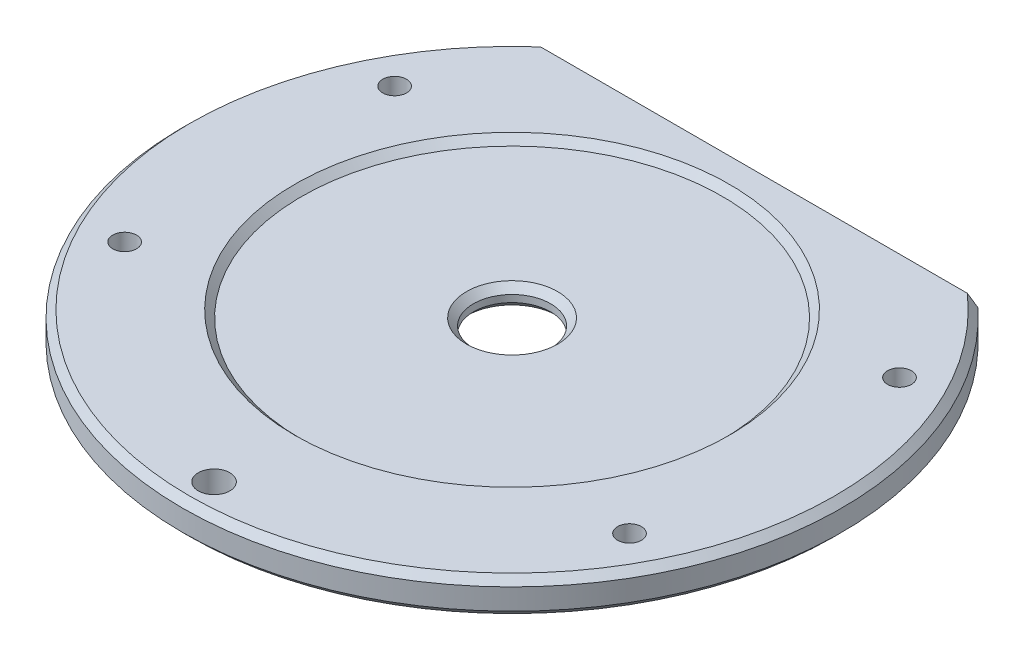
ISO-10303-21;
HEADER;
FILE_DESCRIPTION(('STEP AP214'),'2;1');
FILE_NAME('part.step','',(''),(''),'','','');
FILE_SCHEMA(('AUTOMOTIVE_DESIGN { 1 0 10303 214 1 1 1 1 }'));
ENDSEC;
DATA;
#1=APPLICATION_CONTEXT('core data for automotive mechanical design processes');
#2=APPLICATION_PROTOCOL_DEFINITION('international standard','automotive_design',2000,#1);
#3=PRODUCT_CONTEXT('',#1,'mechanical');
#4=PRODUCT('Part','Part','',(#3));
#5=PRODUCT_RELATED_PRODUCT_CATEGORY('part','',(#4));
#6=PRODUCT_DEFINITION_FORMATION('','',#4);
#7=PRODUCT_DEFINITION_CONTEXT('part definition',#1,'design');
#8=PRODUCT_DEFINITION('design','',#6,#7);
#9=PRODUCT_DEFINITION_SHAPE('','',#8);
#10=(LENGTH_UNIT() NAMED_UNIT(*) SI_UNIT(.MILLI.,.METRE.));
#11=(NAMED_UNIT(*) PLANE_ANGLE_UNIT() SI_UNIT($,.RADIAN.));
#12=(NAMED_UNIT(*) SI_UNIT($,.STERADIAN.) SOLID_ANGLE_UNIT());
#13=UNCERTAINTY_MEASURE_WITH_UNIT(LENGTH_MEASURE(1.E-05),#10,'distance_accuracy_value','');
#14=(GEOMETRIC_REPRESENTATION_CONTEXT(3) GLOBAL_UNCERTAINTY_ASSIGNED_CONTEXT((#13)) GLOBAL_UNIT_ASSIGNED_CONTEXT((#10,
#11,#12)) REPRESENTATION_CONTEXT('',''));
#15=CARTESIAN_POINT('',(0.,0.,0.));
#16=DIRECTION('',(0.,0.,1.));
#17=DIRECTION('',(1.,0.,0.));
#18=AXIS2_PLACEMENT_3D('',#15,#16,#17);
#19=CARTESIAN_POINT('',(0.,-5.,0.));
#20=DIRECTION('',(0.,1.,0.));
#21=DIRECTION('',(0.,0.,1.));
#22=AXIS2_PLACEMENT_3D('',#19,#20,#21);
#23=CYLINDRICAL_SURFACE('',#22,11.);
#24=CARTESIAN_POINT('',(0.,0.999999999999969,0.));
#25=DIRECTION('',(0.,1.,0.));
#26=DIRECTION('',(0.,0.,1.));
#27=AXIS2_PLACEMENT_3D('',#24,#25,#26);
#28=CIRCLE('',#27,11.);
#29=CARTESIAN_POINT('',(0.,0.999999999999969,11.));
#30=VERTEX_POINT('',#29);
#31=EDGE_CURVE('E138',#30,#30,#28,.T.);
#32=ORIENTED_EDGE('',*,*,#31,.T.);
#33=EDGE_LOOP('',(#32));
#34=FACE_BOUND('',#33,.T.);
#35=CARTESIAN_POINT('',(0.,-0.999999999999969,0.));
#36=DIRECTION('',(0.,-1.,0.));
#37=DIRECTION('',(0.,0.,-1.));
#38=AXIS2_PLACEMENT_3D('',#35,#36,#37);
#39=CIRCLE('',#38,11.);
#40=CARTESIAN_POINT('',(0.,-0.999999999999969,-11.));
#41=VERTEX_POINT('',#40);
#42=EDGE_CURVE('E141',#41,#41,#39,.T.);
#43=ORIENTED_EDGE('',*,*,#42,.T.);
#44=EDGE_LOOP('',(#43));
#45=FACE_BOUND('',#44,.T.);
#46=ADVANCED_FACE('F34',(#34,#45),#23,.F.);
#47=CARTESIAN_POINT('',(0.,-5.,0.));
#48=DIRECTION('',(0.,1.,0.));
#49=DIRECTION('',(0.,0.,1.));
#50=AXIS2_PLACEMENT_3D('',#47,#48,#49);
#51=PLANE('',#50);
#52=CARTESIAN_POINT('',(0.,-5.,0.));
#53=DIRECTION('',(0.,1.,0.));
#54=DIRECTION('',(0.,0.,1.));
#55=AXIS2_PLACEMENT_3D('',#52,#53,#54);
#56=CIRCLE('',#55,62.);
#57=CARTESIAN_POINT('',(0.,-5.,62.));
#58=VERTEX_POINT('',#57);
#59=EDGE_CURVE('E85',#58,#58,#56,.T.);
#60=ORIENTED_EDGE('',*,*,#59,.T.);
#61=EDGE_LOOP('',(#60));
#62=FACE_BOUND('',#61,.T.);
#63=CARTESIAN_POINT('',(0.,-5.,85.));
#64=DIRECTION('',(0.,1.,0.));
#65=DIRECTION('',(0.,0.,1.));
#66=AXIS2_PLACEMENT_3D('',#63,#64,#65);
#67=CIRCLE('',#66,4.5);
#68=CARTESIAN_POINT('',(0.,-5.,89.5));
#69=VERTEX_POINT('',#68);
#70=EDGE_CURVE('E181',#69,#69,#67,.T.);
#71=ORIENTED_EDGE('',*,*,#70,.T.);
#72=EDGE_LOOP('',(#71));
#73=FACE_BOUND('',#72,.T.);
#74=CARTESIAN_POINT('',(-72.,-5.,-38.5));
#75=DIRECTION('',(0.,1.,0.));
#76=DIRECTION('',(0.,0.,1.));
#77=AXIS2_PLACEMENT_3D('',#74,#75,#76);
#78=CIRCLE('',#77,3.4);
#79=CARTESIAN_POINT('',(-72.,-5.,-35.1));
#80=VERTEX_POINT('',#79);
#81=EDGE_CURVE('E175',#80,#80,#78,.T.);
#82=ORIENTED_EDGE('',*,*,#81,.T.);
#83=EDGE_LOOP('',(#82));
#84=FACE_BOUND('',#83,.T.);
#85=CARTESIAN_POINT('',(72.,-5.,-38.5));
#86=DIRECTION('',(0.,1.,0.));
#87=DIRECTION('',(0.,0.,1.));
#88=AXIS2_PLACEMENT_3D('',#85,#86,#87);
#89=CIRCLE('',#88,3.4);
#90=CARTESIAN_POINT('',(72.,-5.,-35.1));
#91=VERTEX_POINT('',#90);
#92=EDGE_CURVE('E169',#91,#91,#89,.T.);
#93=ORIENTED_EDGE('',*,*,#92,.T.);
#94=EDGE_LOOP('',(#93));
#95=FACE_BOUND('',#94,.T.);
#96=CARTESIAN_POINT('',(-72.,-5.,38.5));
#97=DIRECTION('',(0.,1.,0.));
#98=DIRECTION('',(0.,0.,1.));
#99=AXIS2_PLACEMENT_3D('',#96,#97,#98);
#100=CIRCLE('',#99,3.4);
#101=CARTESIAN_POINT('',(-72.,-5.,41.9));
#102=VERTEX_POINT('',#101);
#103=EDGE_CURVE('E163',#102,#102,#100,.T.);
#104=ORIENTED_EDGE('',*,*,#103,.T.);
#105=EDGE_LOOP('',(#104));
#106=FACE_BOUND('',#105,.T.);
#107=CARTESIAN_POINT('',(72.,-5.,38.5));
#108=DIRECTION('',(0.,1.,0.));
#109=DIRECTION('',(0.,0.,1.));
#110=AXIS2_PLACEMENT_3D('',#107,#108,#109);
#111=CIRCLE('',#110,3.4);
#112=CARTESIAN_POINT('',(72.,-5.,41.9));
#113=VERTEX_POINT('',#112);
#114=EDGE_CURVE('E157',#113,#113,#111,.T.);
#115=ORIENTED_EDGE('',*,*,#114,.T.);
#116=EDGE_LOOP('',(#115));
#117=FACE_BOUND('',#116,.T.);
#118=DIRECTION('',(1.,0.,0.));
#119=VECTOR('',#118,1.);
#120=CARTESIAN_POINT('',(0.,-5.,-69.));
#121=LINE('',#120,#119);
#122=CARTESIAN_POINT('',(-60.8522801544856,-5.,-69.));
#123=VERTEX_POINT('',#122);
#124=CARTESIAN_POINT('',(60.8522801544856,-5.,-69.));
#125=VERTEX_POINT('',#124);
#126=EDGE_CURVE('E83',#123,#125,#121,.T.);
#127=ORIENTED_EDGE('',*,*,#126,.T.);
#128=CARTESIAN_POINT('',(0.,-5.,0.));
#129=DIRECTION('',(0.,1.,0.));
#130=DIRECTION('',(0.,0.,1.));
#131=AXIS2_PLACEMENT_3D('',#128,#129,#130);
#132=CIRCLE('',#131,92.);
#133=EDGE_CURVE('E80',#125,#123,#132,.F.);
#134=ORIENTED_EDGE('',*,*,#133,.T.);
#135=EDGE_LOOP('',(#127,#134));
#136=FACE_BOUND('',#135,.T.);
#137=ADVANCED_FACE('F82',(#62,#73,#84,#95,#106,#117,#136),#51,.F.);
#138=CARTESIAN_POINT('',(0.,5.,0.));
#139=DIRECTION('',(0.,-1.,0.));
#140=DIRECTION('',(0.,0.,-1.));
#141=AXIS2_PLACEMENT_3D('',#138,#139,#140);
#142=CYLINDRICAL_SURFACE('',#141,94.);
#143=DIRECTION('',(0.,-1.,0.));
#144=VECTOR('',#143,1.);
#145=CARTESIAN_POINT('',(-63.8357266740185,5.,-69.));
#146=LINE('',#145,#144);
#147=CARTESIAN_POINT('',(-63.8357266740185,2.99999999999994,-69.));
#148=VERTEX_POINT('',#147);
#149=CARTESIAN_POINT('',(-63.8357266740185,-3.00000000000001,-69.));
#150=VERTEX_POINT('',#149);
#151=EDGE_CURVE('E92',#148,#150,#146,.T.);
#152=ORIENTED_EDGE('',*,*,#151,.T.);
#153=CARTESIAN_POINT('',(0.,-3.00000000000001,0.));
#154=DIRECTION('',(0.,1.,0.));
#155=DIRECTION('',(0.,0.,1.));
#156=AXIS2_PLACEMENT_3D('',#153,#154,#155);
#157=CIRCLE('',#156,94.);
#158=CARTESIAN_POINT('',(63.8357266740185,-3.00000000000001,-69.));
#159=VERTEX_POINT('',#158);
#160=EDGE_CURVE('E95',#150,#159,#157,.T.);
#161=ORIENTED_EDGE('',*,*,#160,.T.);
#162=DIRECTION('',(0.,-1.,0.));
#163=VECTOR('',#162,1.);
#164=CARTESIAN_POINT('',(63.8357266740185,5.,-69.));
#165=LINE('',#164,#163);
#166=CARTESIAN_POINT('',(63.8357266740185,2.99999999999994,-69.));
#167=VERTEX_POINT('',#166);
#168=EDGE_CURVE('E147',#159,#167,#165,.F.);
#169=ORIENTED_EDGE('',*,*,#168,.T.);
#170=CARTESIAN_POINT('',(0.,2.99999999999994,0.));
#171=DIRECTION('',(0.,1.,0.));
#172=DIRECTION('',(0.,0.,1.));
#173=AXIS2_PLACEMENT_3D('',#170,#171,#172);
#174=CIRCLE('',#173,94.);
#175=EDGE_CURVE('E126',#167,#148,#174,.F.);
#176=ORIENTED_EDGE('',*,*,#175,.T.);
#177=EDGE_LOOP('',(#152,#161,#169,#176));
#178=FACE_BOUND('',#177,.T.);
#179=ADVANCED_FACE('F200',(#178),#142,.T.);
#180=CARTESIAN_POINT('',(0.,5.,0.));
#181=DIRECTION('',(0.,1.,0.));
#182=DIRECTION('',(0.,0.,1.));
#183=AXIS2_PLACEMENT_3D('',#180,#181,#182);
#184=PLANE('',#183);
#185=CARTESIAN_POINT('',(0.,5.,0.));
#186=DIRECTION('',(0.,1.,0.));
#187=DIRECTION('',(0.,0.,1.));
#188=AXIS2_PLACEMENT_3D('',#185,#186,#187);
#189=CIRCLE('',#188,62.);
#190=CARTESIAN_POINT('',(0.,5.,62.));
#191=VERTEX_POINT('',#190);
#192=EDGE_CURVE('E128',#191,#191,#189,.F.);
#193=ORIENTED_EDGE('',*,*,#192,.T.);
#194=EDGE_LOOP('',(#193));
#195=FACE_BOUND('',#194,.T.);
#196=CARTESIAN_POINT('',(0.,5.,85.));
#197=DIRECTION('',(0.,1.,0.));
#198=DIRECTION('',(0.,0.,1.));
#199=AXIS2_PLACEMENT_3D('',#196,#197,#198);
#200=CIRCLE('',#199,4.5);
#201=CARTESIAN_POINT('',(0.,5.,89.5));
#202=VERTEX_POINT('',#201);
#203=EDGE_CURVE('E182',#202,#202,#200,.T.);
#204=ORIENTED_EDGE('',*,*,#203,.F.);
#205=EDGE_LOOP('',(#204));
#206=FACE_BOUND('',#205,.T.);
#207=CARTESIAN_POINT('',(-72.,5.,-38.5));
#208=DIRECTION('',(0.,1.,0.));
#209=DIRECTION('',(0.,0.,1.));
#210=AXIS2_PLACEMENT_3D('',#207,#208,#209);
#211=CIRCLE('',#210,3.4);
#212=CARTESIAN_POINT('',(-72.,5.,-35.1));
#213=VERTEX_POINT('',#212);
#214=EDGE_CURVE('E178',#213,#213,#211,.T.);
#215=ORIENTED_EDGE('',*,*,#214,.F.);
#216=EDGE_LOOP('',(#215));
#217=FACE_BOUND('',#216,.T.);
#218=CARTESIAN_POINT('',(72.,5.,-38.5));
#219=DIRECTION('',(0.,1.,0.));
#220=DIRECTION('',(0.,0.,1.));
#221=AXIS2_PLACEMENT_3D('',#218,#219,#220);
#222=CIRCLE('',#221,3.4);
#223=CARTESIAN_POINT('',(72.,5.,-35.1));
#224=VERTEX_POINT('',#223);
#225=EDGE_CURVE('E172',#224,#224,#222,.T.);
#226=ORIENTED_EDGE('',*,*,#225,.F.);
#227=EDGE_LOOP('',(#226));
#228=FACE_BOUND('',#227,.T.);
#229=CARTESIAN_POINT('',(-72.,5.,38.5));
#230=DIRECTION('',(0.,1.,0.));
#231=DIRECTION('',(0.,0.,1.));
#232=AXIS2_PLACEMENT_3D('',#229,#230,#231);
#233=CIRCLE('',#232,3.4);
#234=CARTESIAN_POINT('',(-72.,5.,41.9));
#235=VERTEX_POINT('',#234);
#236=EDGE_CURVE('E166',#235,#235,#233,.T.);
#237=ORIENTED_EDGE('',*,*,#236,.F.);
#238=EDGE_LOOP('',(#237));
#239=FACE_BOUND('',#238,.T.);
#240=CARTESIAN_POINT('',(72.,5.,38.5));
#241=DIRECTION('',(0.,1.,0.));
#242=DIRECTION('',(0.,0.,1.));
#243=AXIS2_PLACEMENT_3D('',#240,#241,#242);
#244=CIRCLE('',#243,3.4);
#245=CARTESIAN_POINT('',(72.,5.,41.9));
#246=VERTEX_POINT('',#245);
#247=EDGE_CURVE('E160',#246,#246,#244,.T.);
#248=ORIENTED_EDGE('',*,*,#247,.F.);
#249=EDGE_LOOP('',(#248));
#250=FACE_BOUND('',#249,.T.);
#251=DIRECTION('',(1.,0.,0.));
#252=VECTOR('',#251,1.);
#253=CARTESIAN_POINT('',(-96.2922374429224,5.,-69.));
#254=LINE('',#253,#252);
#255=CARTESIAN_POINT('',(-60.8522801544856,5.,-69.));
#256=VERTEX_POINT('',#255);
#257=CARTESIAN_POINT('',(60.8522801544856,5.,-69.));
#258=VERTEX_POINT('',#257);
#259=EDGE_CURVE('E149',#256,#258,#254,.T.);
#260=ORIENTED_EDGE('',*,*,#259,.F.);
#261=CARTESIAN_POINT('',(0.,5.,0.));
#262=DIRECTION('',(0.,1.,0.));
#263=DIRECTION('',(0.,0.,1.));
#264=AXIS2_PLACEMENT_3D('',#261,#262,#263);
#265=CIRCLE('',#264,92.);
#266=EDGE_CURVE('E131',#256,#258,#265,.T.);
#267=ORIENTED_EDGE('',*,*,#266,.T.);
#268=EDGE_LOOP('',(#260,#267));
#269=FACE_BOUND('',#268,.T.);
#270=ADVANCED_FACE('F114',(#195,#206,#217,#228,#239,#250,#269),#184,.T.);
#271=CARTESIAN_POINT('',(-96.2922374429224,-5.,-69.));
#272=DIRECTION('',(0.,0.,1.));
#273=DIRECTION('',(1.,0.,0.));
#274=AXIS2_PLACEMENT_3D('',#271,#272,#273);
#275=PLANE('',#274);
#276=ORIENTED_EDGE('',*,*,#168,.F.);
#277=CARTESIAN_POINT('',(63.8357266740185,-3.00000000000001,-69.));
#278=CARTESIAN_POINT('',(63.588108661684,-3.16815814706882,-69.));
#279=CARTESIAN_POINT('',(63.3402456768234,-3.33595567307789,-69.));
#280=CARTESIAN_POINT('',(62.8440231824841,-3.67080993712542,-69.));
#281=CARTESIAN_POINT('',(62.5956636776362,-3.8378666820264,-69.));
#282=CARTESIAN_POINT('',(62.0984368913299,-4.17122301130456,-69.));
#283=CARTESIAN_POINT('',(61.8495696097177,-4.33752259545236,-69.));
#284=CARTESIAN_POINT('',(61.3513159270398,-4.66934726982986,-69.));
#285=CARTESIAN_POINT('',(61.1019295211762,-4.83487235285525,-69.));
#286=CARTESIAN_POINT('',(60.8522801544856,-5.,-69.));
#287=B_SPLINE_CURVE_WITH_KNOTS('',3,(#277,#278,#279,#280,#281,#282,#283,#284,#285,#286),
.UNSPECIFIED.,.F.,.F.,(4,2,2,2,4),(0.,0.897956663475132,1.79590499091896,2.69385359038765,
3.59181052593058),.UNSPECIFIED.);
#288=EDGE_CURVE('E11',#159,#125,#287,.T.);
#289=ORIENTED_EDGE('',*,*,#288,.T.);
#290=ORIENTED_EDGE('',*,*,#126,.F.);
#291=CARTESIAN_POINT('',(-60.8522801544856,-5.,-69.));
#292=CARTESIAN_POINT('',(-61.1019295211762,-4.83487235285524,-69.));
#293=CARTESIAN_POINT('',(-61.3513159270397,-4.66934726982984,-69.));
#294=CARTESIAN_POINT('',(-61.8495696097177,-4.33752259545235,-69.));
#295=CARTESIAN_POINT('',(-62.0984368913299,-4.17122301130456,-69.));
#296=CARTESIAN_POINT('',(-62.5956636776362,-3.83786668202639,-69.));
#297=CARTESIAN_POINT('',(-62.8440231824841,-3.6708099371254,-69.));
#298=CARTESIAN_POINT('',(-63.3402456768234,-3.33595567307786,-69.));
#299=CARTESIAN_POINT('',(-63.588108661684,-3.1681581470688,-69.));
#300=CARTESIAN_POINT('',(-63.8357266740186,-3.00000000000001,-69.));
#301=B_SPLINE_CURVE_WITH_KNOTS('',3,(#291,#292,#293,#294,#295,#296,#297,#298,#299,#300),
.UNSPECIFIED.,.F.,.F.,(4,2,2,2,4),(0.,0.897956935542931,1.79590553501163,2.69385386245547,
3.59181052593059),.UNSPECIFIED.);
#302=EDGE_CURVE('E48',#123,#150,#301,.T.);
#303=ORIENTED_EDGE('',*,*,#302,.T.);
#304=ORIENTED_EDGE('',*,*,#151,.F.);
#305=CARTESIAN_POINT('',(-63.8357266740185,2.99999999999994,-69.));
#306=CARTESIAN_POINT('',(-63.588108661684,3.16815814706874,-69.));
#307=CARTESIAN_POINT('',(-63.3402456768234,3.33595567307782,-69.));
#308=CARTESIAN_POINT('',(-62.8440231824841,3.67080993712536,-69.));
#309=CARTESIAN_POINT('',(-62.5956636776362,3.83786668202636,-69.));
#310=CARTESIAN_POINT('',(-62.0984368913298,4.17122301130454,-69.));
#311=CARTESIAN_POINT('',(-61.8495696097176,4.33752259545233,-69.));
#312=CARTESIAN_POINT('',(-61.3513159270397,4.66934726982984,-69.));
#313=CARTESIAN_POINT('',(-61.1019295211762,4.83487235285524,-69.));
#314=CARTESIAN_POINT('',(-60.8522801544856,5.00000000000002,-69.));
#315=B_SPLINE_CURVE_WITH_KNOTS('',3,(#305,#306,#307,#308,#309,#310,#311,#312,#313,#314),
.UNSPECIFIED.,.F.,.F.,(4,2,2,2,4),(0.,0.897956663475147,1.795904990919,2.69385359038772,
3.59181052593067),.UNSPECIFIED.);
#316=EDGE_CURVE('E96',#148,#256,#315,.T.);
#317=ORIENTED_EDGE('',*,*,#316,.T.);
#318=ORIENTED_EDGE('',*,*,#259,.T.);
#319=CARTESIAN_POINT('',(60.8522801544856,5.,-69.));
#320=CARTESIAN_POINT('',(61.1019295211762,4.83487235285524,-69.));
#321=CARTESIAN_POINT('',(61.3513159270397,4.66934726982984,-69.));
#322=CARTESIAN_POINT('',(61.8495696097176,4.33752259545233,-69.));
#323=CARTESIAN_POINT('',(62.0984368913298,4.17122301130454,-69.));
#324=CARTESIAN_POINT('',(62.5956636776362,3.83786668202636,-69.));
#325=CARTESIAN_POINT('',(62.8440231824841,3.67080993712538,-69.));
#326=CARTESIAN_POINT('',(63.3402456768234,3.33595567307784,-69.));
#327=CARTESIAN_POINT('',(63.588108661684,3.16815814706876,-69.));
#328=CARTESIAN_POINT('',(63.8357266740185,2.99999999999995,-69.));
#329=B_SPLINE_CURVE_WITH_KNOTS('',3,(#319,#320,#321,#322,#323,#324,#325,#326,#327,#328),
.UNSPECIFIED.,.F.,.F.,(4,2,2,2,4),(0.,0.897956935542949,1.79590553501166,2.6938538624555,
3.59181052593066),.UNSPECIFIED.);
#330=EDGE_CURVE('E55',#258,#167,#329,.T.);
#331=ORIENTED_EDGE('',*,*,#330,.T.);
#332=EDGE_LOOP('',(#276,#289,#290,#303,#304,#317,#318,#331));
#333=FACE_BOUND('',#332,.T.);
#334=ADVANCED_FACE('F88',(#333),#275,.F.);
#335=CARTESIAN_POINT('',(0.,3.,0.));
#336=DIRECTION('',(0.,1.,0.));
#337=DIRECTION('',(0.,0.,1.));
#338=AXIS2_PLACEMENT_3D('',#335,#336,#337);
#339=PLANE('',#338);
#340=CARTESIAN_POINT('',(0.,3.,0.));
#341=DIRECTION('',(0.,1.,0.));
#342=DIRECTION('',(0.,0.,1.));
#343=AXIS2_PLACEMENT_3D('',#340,#341,#342);
#344=CIRCLE('',#343,13.);
#345=CARTESIAN_POINT('',(0.,3.,13.));
#346=VERTEX_POINT('',#345);
#347=EDGE_CURVE('E91',#346,#346,#344,.F.);
#348=ORIENTED_EDGE('',*,*,#347,.T.);
#349=EDGE_LOOP('',(#348));
#350=FACE_BOUND('',#349,.T.);
#351=CARTESIAN_POINT('',(0.,3.,0.));
#352=DIRECTION('',(0.,1.,0.));
#353=DIRECTION('',(0.,0.,1.));
#354=AXIS2_PLACEMENT_3D('',#351,#352,#353);
#355=CIRCLE('',#354,60.);
#356=CARTESIAN_POINT('',(0.,3.,60.));
#357=VERTEX_POINT('',#356);
#358=EDGE_CURVE('E151',#357,#357,#355,.T.);
#359=ORIENTED_EDGE('',*,*,#358,.T.);
#360=EDGE_LOOP('',(#359));
#361=FACE_BOUND('',#360,.T.);
#362=ADVANCED_FACE('F113',(#350,#361),#339,.T.);
#363=CARTESIAN_POINT('',(0.,-3.,0.));
#364=DIRECTION('',(0.,-1.,0.));
#365=DIRECTION('',(0.,0.,1.));
#366=AXIS2_PLACEMENT_3D('',#363,#364,#365);
#367=PLANE('',#366);
#368=CARTESIAN_POINT('',(0.,-3.,0.));
#369=DIRECTION('',(0.,-1.,0.));
#370=DIRECTION('',(0.,0.,-1.));
#371=AXIS2_PLACEMENT_3D('',#368,#369,#370);
#372=CIRCLE('',#371,13.);
#373=CARTESIAN_POINT('',(0.,-3.,-13.));
#374=VERTEX_POINT('',#373);
#375=EDGE_CURVE('E86',#374,#374,#372,.F.);
#376=ORIENTED_EDGE('',*,*,#375,.T.);
#377=EDGE_LOOP('',(#376));
#378=FACE_BOUND('',#377,.T.);
#379=CARTESIAN_POINT('',(0.,-3.,0.));
#380=DIRECTION('',(0.,1.,0.));
#381=DIRECTION('',(0.,0.,1.));
#382=AXIS2_PLACEMENT_3D('',#379,#380,#381);
#383=CIRCLE('',#382,60.);
#384=CARTESIAN_POINT('',(0.,-3.,60.));
#385=VERTEX_POINT('',#384);
#386=EDGE_CURVE('E154',#385,#385,#383,.T.);
#387=ORIENTED_EDGE('',*,*,#386,.F.);
#388=EDGE_LOOP('',(#387));
#389=FACE_BOUND('',#388,.T.);
#390=ADVANCED_FACE('F238',(#378,#389),#367,.T.);
#391=CARTESIAN_POINT('',(72.,5.,38.5));
#392=DIRECTION('',(0.,1.,0.));
#393=DIRECTION('',(0.,0.,1.));
#394=AXIS2_PLACEMENT_3D('',#391,#392,#393);
#395=CYLINDRICAL_SURFACE('',#394,3.4);
#396=ORIENTED_EDGE('',*,*,#247,.T.);
#397=EDGE_LOOP('',(#396));
#398=FACE_BOUND('',#397,.T.);
#399=ORIENTED_EDGE('',*,*,#114,.F.);
#400=EDGE_LOOP('',(#399));
#401=FACE_BOUND('',#400,.T.);
#402=ADVANCED_FACE('F241',(#398,#401),#395,.F.);
#403=CARTESIAN_POINT('',(-72.,5.,38.5));
#404=DIRECTION('',(0.,1.,0.));
#405=DIRECTION('',(0.,0.,1.));
#406=AXIS2_PLACEMENT_3D('',#403,#404,#405);
#407=CYLINDRICAL_SURFACE('',#406,3.4);
#408=ORIENTED_EDGE('',*,*,#236,.T.);
#409=EDGE_LOOP('',(#408));
#410=FACE_BOUND('',#409,.T.);
#411=ORIENTED_EDGE('',*,*,#103,.F.);
#412=EDGE_LOOP('',(#411));
#413=FACE_BOUND('',#412,.T.);
#414=ADVANCED_FACE('F270',(#410,#413),#407,.F.);
#415=CARTESIAN_POINT('',(72.,5.,-38.5));
#416=DIRECTION('',(0.,1.,0.));
#417=DIRECTION('',(0.,0.,1.));
#418=AXIS2_PLACEMENT_3D('',#415,#416,#417);
#419=CYLINDRICAL_SURFACE('',#418,3.4);
#420=ORIENTED_EDGE('',*,*,#225,.T.);
#421=EDGE_LOOP('',(#420));
#422=FACE_BOUND('',#421,.T.);
#423=ORIENTED_EDGE('',*,*,#92,.F.);
#424=EDGE_LOOP('',(#423));
#425=FACE_BOUND('',#424,.T.);
#426=ADVANCED_FACE('F274',(#422,#425),#419,.F.);
#427=CARTESIAN_POINT('',(-72.,5.,-38.5));
#428=DIRECTION('',(0.,1.,0.));
#429=DIRECTION('',(0.,0.,1.));
#430=AXIS2_PLACEMENT_3D('',#427,#428,#429);
#431=CYLINDRICAL_SURFACE('',#430,3.4);
#432=ORIENTED_EDGE('',*,*,#214,.T.);
#433=EDGE_LOOP('',(#432));
#434=FACE_BOUND('',#433,.T.);
#435=ORIENTED_EDGE('',*,*,#81,.F.);
#436=EDGE_LOOP('',(#435));
#437=FACE_BOUND('',#436,.T.);
#438=ADVANCED_FACE('F194',(#434,#437),#431,.F.);
#439=CARTESIAN_POINT('',(0.,-5.,85.));
#440=DIRECTION('',(0.,1.,0.));
#441=DIRECTION('',(0.,0.,1.));
#442=AXIS2_PLACEMENT_3D('',#439,#440,#441);
#443=CYLINDRICAL_SURFACE('',#442,4.5);
#444=ORIENTED_EDGE('',*,*,#70,.F.);
#445=EDGE_LOOP('',(#444));
#446=FACE_BOUND('',#445,.T.);
#447=ORIENTED_EDGE('',*,*,#203,.T.);
#448=EDGE_LOOP('',(#447));
#449=FACE_BOUND('',#448,.T.);
#450=ADVANCED_FACE('F190',(#446,#449),#443,.F.);
#451=CARTESIAN_POINT('',(0.,3.,0.));
#452=DIRECTION('',(0.,1.,0.));
#453=DIRECTION('',(0.,0.,1.));
#454=AXIS2_PLACEMENT_3D('',#451,#452,#453);
#455=CONICAL_SURFACE('',#454,13.,0.78539816339745);
#456=ORIENTED_EDGE('',*,*,#31,.F.);
#457=EDGE_LOOP('',(#456));
#458=FACE_BOUND('',#457,.T.);
#459=ORIENTED_EDGE('',*,*,#347,.F.);
#460=EDGE_LOOP('',(#459));
#461=FACE_BOUND('',#460,.T.);
#462=ADVANCED_FACE('F193',(#458,#461),#455,.F.);
#463=CARTESIAN_POINT('',(0.,-3.,0.));
#464=DIRECTION('',(0.,-1.,0.));
#465=DIRECTION('',(0.,0.,-1.));
#466=AXIS2_PLACEMENT_3D('',#463,#464,#465);
#467=CONICAL_SURFACE('',#466,13.,0.785398163397444);
#468=ORIENTED_EDGE('',*,*,#42,.F.);
#469=EDGE_LOOP('',(#468));
#470=FACE_BOUND('',#469,.T.);
#471=ORIENTED_EDGE('',*,*,#375,.F.);
#472=EDGE_LOOP('',(#471));
#473=FACE_BOUND('',#472,.T.);
#474=ADVANCED_FACE('F231',(#470,#473),#467,.F.);
#475=CARTESIAN_POINT('',(0.,-5.,0.));
#476=DIRECTION('',(0.,-1.,0.));
#477=DIRECTION('',(0.,0.,-1.));
#478=AXIS2_PLACEMENT_3D('',#475,#476,#477);
#479=CONICAL_SURFACE('',#478,62.,0.785398163397445);
#480=ORIENTED_EDGE('',*,*,#386,.T.);
#481=EDGE_LOOP('',(#480));
#482=FACE_BOUND('',#481,.T.);
#483=ORIENTED_EDGE('',*,*,#59,.F.);
#484=EDGE_LOOP('',(#483));
#485=FACE_BOUND('',#484,.T.);
#486=ADVANCED_FACE('F234',(#482,#485),#479,.F.);
#487=CARTESIAN_POINT('',(0.,2.99999999999999,0.));
#488=DIRECTION('',(0.,1.,0.));
#489=DIRECTION('',(0.,0.,1.));
#490=AXIS2_PLACEMENT_3D('',#487,#488,#489);
#491=CONICAL_SURFACE('',#490,60.,0.785398163397448);
#492=ORIENTED_EDGE('',*,*,#192,.F.);
#493=EDGE_LOOP('',(#492));
#494=FACE_BOUND('',#493,.T.);
#495=ORIENTED_EDGE('',*,*,#358,.F.);
#496=EDGE_LOOP('',(#495));
#497=FACE_BOUND('',#496,.T.);
#498=ADVANCED_FACE('F247',(#494,#497),#491,.F.);
#499=CARTESIAN_POINT('',(0.,-3.00000000000001,0.));
#500=DIRECTION('',(0.,1.,0.));
#501=DIRECTION('',(0.,0.,1.));
#502=AXIS2_PLACEMENT_3D('',#499,#500,#501);
#503=CONICAL_SURFACE('',#502,94.,0.785398163397448);
#504=ORIENTED_EDGE('',*,*,#302,.F.);
#505=ORIENTED_EDGE('',*,*,#133,.F.);
#506=ORIENTED_EDGE('',*,*,#288,.F.);
#507=ORIENTED_EDGE('',*,*,#160,.F.);
#508=EDGE_LOOP('',(#504,#505,#506,#507));
#509=FACE_BOUND('',#508,.T.);
#510=ADVANCED_FACE('F94',(#509),#503,.T.);
#511=CARTESIAN_POINT('',(0.,5.,0.));
#512=DIRECTION('',(0.,-1.,0.));
#513=DIRECTION('',(0.,0.,-1.));
#514=AXIS2_PLACEMENT_3D('',#511,#512,#513);
#515=CONICAL_SURFACE('',#514,92.,0.785398163397438);
#516=ORIENTED_EDGE('',*,*,#316,.F.);
#517=ORIENTED_EDGE('',*,*,#175,.F.);
#518=ORIENTED_EDGE('',*,*,#330,.F.);
#519=ORIENTED_EDGE('',*,*,#266,.F.);
#520=EDGE_LOOP('',(#516,#517,#518,#519));
#521=FACE_BOUND('',#520,.T.);
#522=ADVANCED_FACE('F36',(#521),#515,.T.);
#523=CLOSED_SHELL('',(#46,#137,#179,#270,#334,#362,#390,#402,#414,#426,#438,#450,#462,#474,#486,
#498,#510,#522));
#524=MANIFOLD_SOLID_BREP('B2',#523);
#525=ADVANCED_BREP_SHAPE_REPRESENTATION('',(#18,#524),#14);
#526=SHAPE_DEFINITION_REPRESENTATION(#9,#525);
ENDSEC;
END-ISO-10303-21;
